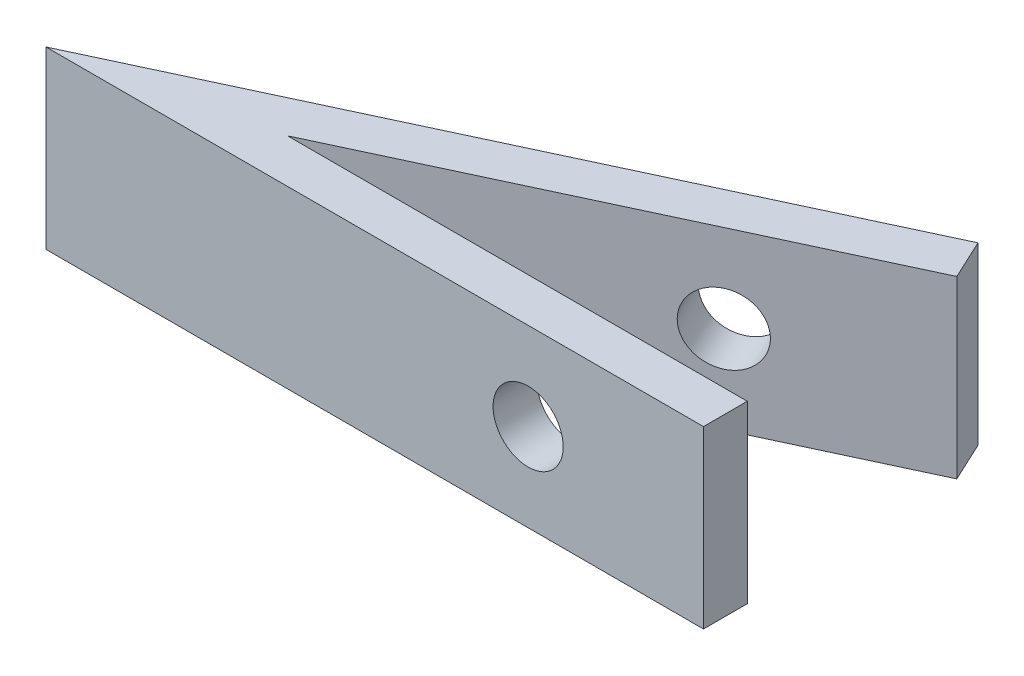
ISO-10303-21;
HEADER;
FILE_DESCRIPTION(('STEP AP214'),'2;1');
FILE_NAME('part.step','',(''),(''),'','','');
FILE_SCHEMA(('AUTOMOTIVE_DESIGN { 1 0 10303 214 1 1 1 1 }'));
ENDSEC;
DATA;
#1=APPLICATION_CONTEXT('core data for automotive mechanical design processes');
#2=APPLICATION_PROTOCOL_DEFINITION('international standard','automotive_design',2000,#1);
#3=PRODUCT_CONTEXT('',#1,'mechanical');
#4=PRODUCT('Part','Part','',(#3));
#5=PRODUCT_RELATED_PRODUCT_CATEGORY('part','',(#4));
#6=PRODUCT_DEFINITION_FORMATION('','',#4);
#7=PRODUCT_DEFINITION_CONTEXT('part definition',#1,'design');
#8=PRODUCT_DEFINITION('design','',#6,#7);
#9=PRODUCT_DEFINITION_SHAPE('','',#8);
#10=(LENGTH_UNIT() NAMED_UNIT(*) SI_UNIT(.MILLI.,.METRE.));
#11=(NAMED_UNIT(*) PLANE_ANGLE_UNIT() SI_UNIT($,.RADIAN.));
#12=(NAMED_UNIT(*) SI_UNIT($,.STERADIAN.) SOLID_ANGLE_UNIT());
#13=UNCERTAINTY_MEASURE_WITH_UNIT(LENGTH_MEASURE(1.E-05),#10,'distance_accuracy_value','');
#14=(GEOMETRIC_REPRESENTATION_CONTEXT(3) GLOBAL_UNCERTAINTY_ASSIGNED_CONTEXT((#13)) GLOBAL_UNIT_ASSIGNED_CONTEXT((#10,
#11,#12)) REPRESENTATION_CONTEXT('',''));
#15=CARTESIAN_POINT('',(0.,0.,0.));
#16=DIRECTION('',(0.,0.,1.));
#17=DIRECTION('',(1.,0.,0.));
#18=AXIS2_PLACEMENT_3D('',#15,#16,#17);
#19=CARTESIAN_POINT('',(0.,20.,0.));
#20=DIRECTION('',(0.,0.,-1.));
#21=DIRECTION('',(-1.,0.,0.));
#22=AXIS2_PLACEMENT_3D('',#19,#20,#21);
#23=PLANE('',#22);
#24=CARTESIAN_POINT('',(17.6796770048478,10.,0.));
#25=DIRECTION('',(0.,0.,1.));
#26=DIRECTION('',(1.,0.,0.));
#27=AXIS2_PLACEMENT_3D('',#24,#25,#26);
#28=CIRCLE('',#27,4.);
#29=CARTESIAN_POINT('',(21.6796770048478,10.,0.));
#30=VERTEX_POINT('',#29);
#31=EDGE_CURVE('E157',#30,#30,#28,.T.);
#32=ORIENTED_EDGE('',*,*,#31,.F.);
#33=EDGE_LOOP('',(#32));
#34=FACE_BOUND('',#33,.T.);
#35=DIRECTION('',(1.,0.,0.));
#36=VECTOR('',#35,1.);
#37=CARTESIAN_POINT('',(0.,0.,0.));
#38=LINE('',#37,#36);
#39=CARTESIAN_POINT('',(-37.3203229951522,0.,0.));
#40=VERTEX_POINT('',#39);
#41=CARTESIAN_POINT('',(37.6796770048478,0.,0.));
#42=VERTEX_POINT('',#41);
#43=EDGE_CURVE('E83',#40,#42,#38,.T.);
#44=ORIENTED_EDGE('',*,*,#43,.T.);
#45=DIRECTION('',(0.,-1.,0.));
#46=VECTOR('',#45,1.);
#47=CARTESIAN_POINT('',(37.6796770048478,20.,0.));
#48=LINE('',#47,#46);
#49=CARTESIAN_POINT('',(37.6796770048478,20.,0.));
#50=VERTEX_POINT('',#49);
#51=EDGE_CURVE('E11',#50,#42,#48,.T.);
#52=ORIENTED_EDGE('',*,*,#51,.F.);
#53=DIRECTION('',(1.,0.,0.));
#54=VECTOR('',#53,1.);
#55=CARTESIAN_POINT('',(-37.3203229951522,20.,0.));
#56=LINE('',#55,#54);
#57=CARTESIAN_POINT('',(-37.3203229951522,20.,0.));
#58=VERTEX_POINT('',#57);
#59=EDGE_CURVE('E89',#58,#50,#56,.T.);
#60=ORIENTED_EDGE('',*,*,#59,.F.);
#61=DIRECTION('',(0.,-1.,0.));
#62=VECTOR('',#61,1.);
#63=CARTESIAN_POINT('',(-37.3203229951522,20.,0.));
#64=LINE('',#63,#62);
#65=EDGE_CURVE('E117',#58,#40,#64,.T.);
#66=ORIENTED_EDGE('',*,*,#65,.T.);
#67=EDGE_LOOP('',(#44,#52,#60,#66));
#68=FACE_BOUND('',#67,.T.);
#69=ADVANCED_FACE('F37',(#34,#68),#23,.F.);
#70=CARTESIAN_POINT('',(37.6796770048478,20.,0.));
#71=DIRECTION('',(-1.,0.,0.));
#72=DIRECTION('',(0.,0.,1.));
#73=AXIS2_PLACEMENT_3D('',#70,#71,#72);
#74=PLANE('',#73);
#75=DIRECTION('',(0.,0.,-1.));
#76=VECTOR('',#75,1.);
#77=CARTESIAN_POINT('',(37.6796770048478,0.,0.));
#78=LINE('',#77,#76);
#79=CARTESIAN_POINT('',(37.6796770048478,0.,-5.));
#80=VERTEX_POINT('',#79);
#81=EDGE_CURVE('E122',#42,#80,#78,.T.);
#82=ORIENTED_EDGE('',*,*,#81,.T.);
#83=DIRECTION('',(0.,-1.,0.));
#84=VECTOR('',#83,1.);
#85=CARTESIAN_POINT('',(37.6796770048478,20.,-5.));
#86=LINE('',#85,#84);
#87=CARTESIAN_POINT('',(37.6796770048478,20.,-5.));
#88=VERTEX_POINT('',#87);
#89=EDGE_CURVE('E45',#88,#80,#86,.T.);
#90=ORIENTED_EDGE('',*,*,#89,.F.);
#91=DIRECTION('',(0.,0.,-1.));
#92=VECTOR('',#91,1.);
#93=CARTESIAN_POINT('',(37.6796770048478,20.,0.));
#94=LINE('',#93,#92);
#95=EDGE_CURVE('E145',#50,#88,#94,.T.);
#96=ORIENTED_EDGE('',*,*,#95,.F.);
#97=ORIENTED_EDGE('',*,*,#51,.T.);
#98=EDGE_LOOP('',(#82,#90,#96,#97));
#99=FACE_BOUND('',#98,.T.);
#100=ADVANCED_FACE('F164',(#99),#74,.F.);
#101=CARTESIAN_POINT('',(37.6796770048478,20.,-5.));
#102=DIRECTION('',(0.,0.,1.));
#103=DIRECTION('',(1.,0.,0.));
#104=AXIS2_PLACEMENT_3D('',#101,#102,#103);
#105=PLANE('',#104);
#106=CARTESIAN_POINT('',(17.6796770048478,10.,-5.));
#107=DIRECTION('',(0.,0.,1.));
#108=DIRECTION('',(1.,0.,0.));
#109=AXIS2_PLACEMENT_3D('',#106,#107,#108);
#110=CIRCLE('',#109,4.);
#111=CARTESIAN_POINT('',(21.6796770048478,10.,-5.));
#112=VERTEX_POINT('',#111);
#113=EDGE_CURVE('E154',#112,#112,#110,.F.);
#114=ORIENTED_EDGE('',*,*,#113,.F.);
#115=EDGE_LOOP('',(#114));
#116=FACE_BOUND('',#115,.T.);
#117=DIRECTION('',(-1.,0.,0.));
#118=VECTOR('',#117,1.);
#119=CARTESIAN_POINT('',(37.6796770048478,0.,-5.));
#120=LINE('',#119,#118);
#121=CARTESIAN_POINT('',(-14.7667804768416,0.,-4.99999999999999));
#122=VERTEX_POINT('',#121);
#123=EDGE_CURVE('E125',#80,#122,#120,.T.);
#124=ORIENTED_EDGE('',*,*,#123,.T.);
#125=DIRECTION('',(0.,-1.,0.));
#126=VECTOR('',#125,1.);
#127=CARTESIAN_POINT('',(-14.7667804768416,20.,-4.99999999999999));
#128=LINE('',#127,#126);
#129=CARTESIAN_POINT('',(-14.7667804768416,20.,-4.99999999999999));
#130=VERTEX_POINT('',#129);
#131=EDGE_CURVE('E112',#130,#122,#128,.T.);
#132=ORIENTED_EDGE('',*,*,#131,.F.);
#133=DIRECTION('',(-1.,0.,0.));
#134=VECTOR('',#133,1.);
#135=CARTESIAN_POINT('',(37.6796770048478,20.,-5.));
#136=LINE('',#135,#134);
#137=EDGE_CURVE('E103',#88,#130,#136,.T.);
#138=ORIENTED_EDGE('',*,*,#137,.F.);
#139=ORIENTED_EDGE('',*,*,#89,.T.);
#140=EDGE_LOOP('',(#124,#132,#138,#139));
#141=FACE_BOUND('',#140,.T.);
#142=ADVANCED_FACE('F138',(#116,#141),#105,.F.);
#143=CARTESIAN_POINT('',(-14.7667804768416,20.,-4.99999999999999));
#144=DIRECTION('',(-0.422618261740694,0.,-0.906307787036652));
#145=DIRECTION('',(-0.906307787036652,0.,0.422618261740694));
#146=AXIS2_PLACEMENT_3D('',#143,#144,#145);
#147=PLANE('',#146);
#148=CARTESIAN_POINT('',(19.1712355357505,10.,-20.8255567692584));
#149=DIRECTION('',(-0.422618261740694,0.,-0.906307787036652));
#150=DIRECTION('',(-0.906307787036652,0.,0.422618261740694));
#151=AXIS2_PLACEMENT_3D('',#148,#149,#150);
#152=CIRCLE('',#151,4.00000000000001);
#153=CARTESIAN_POINT('',(15.5460043876038,10.,-19.1350837222956));
#154=VERTEX_POINT('',#153);
#155=EDGE_CURVE('E123',#154,#154,#152,.F.);
#156=ORIENTED_EDGE('',*,*,#155,.F.);
#157=EDGE_LOOP('',(#156));
#158=FACE_BOUND('',#157,.T.);
#159=DIRECTION('',(0.906307787036652,0.,-0.422618261740694));
#160=VECTOR('',#159,1.);
#161=CARTESIAN_POINT('',(-14.7667804768416,0.,-4.99999999999999));
#162=LINE('',#161,#160);
#163=CARTESIAN_POINT('',(37.2973912764835,0.,-29.2779220040723));
#164=VERTEX_POINT('',#163);
#165=EDGE_CURVE('E111',#122,#164,#162,.T.);
#166=ORIENTED_EDGE('',*,*,#165,.T.);
#167=DIRECTION('',(0.,-1.,0.));
#168=VECTOR('',#167,1.);
#169=CARTESIAN_POINT('',(37.2973912764835,20.,-29.2779220040723));
#170=LINE('',#169,#168);
#171=CARTESIAN_POINT('',(37.2973912764835,20.,-29.2779220040723));
#172=VERTEX_POINT('',#171);
#173=EDGE_CURVE('E108',#172,#164,#170,.T.);
#174=ORIENTED_EDGE('',*,*,#173,.F.);
#175=DIRECTION('',(0.906307787036652,0.,-0.422618261740694));
#176=VECTOR('',#175,1.);
#177=CARTESIAN_POINT('',(-14.7667804768416,20.,-4.99999999999999));
#178=LINE('',#177,#176);
#179=EDGE_CURVE('E97',#130,#172,#178,.T.);
#180=ORIENTED_EDGE('',*,*,#179,.F.);
#181=ORIENTED_EDGE('',*,*,#131,.T.);
#182=EDGE_LOOP('',(#166,#174,#180,#181));
#183=FACE_BOUND('',#182,.T.);
#184=ADVANCED_FACE('F109',(#158,#183),#147,.F.);
#185=CARTESIAN_POINT('',(37.2973912764835,20.,-29.2779220040723));
#186=DIRECTION('',(-0.906307787036652,0.,0.422618261740695));
#187=DIRECTION('',(0.422618261740695,0.,0.906307787036652));
#188=AXIS2_PLACEMENT_3D('',#185,#186,#187);
#189=PLANE('',#188);
#190=DIRECTION('',(-0.422618261740694,0.,-0.906307787036652));
#191=VECTOR('',#190,1.);
#192=CARTESIAN_POINT('',(37.2973912764835,0.,-29.2779220040723));
#193=LINE('',#192,#191);
#194=CARTESIAN_POINT('',(35.18429996778,0.,-33.8094609392555));
#195=VERTEX_POINT('',#194);
#196=EDGE_CURVE('E76',#164,#195,#193,.T.);
#197=ORIENTED_EDGE('',*,*,#196,.T.);
#198=DIRECTION('',(0.,-1.,0.));
#199=VECTOR('',#198,1.);
#200=CARTESIAN_POINT('',(35.18429996778,20.,-33.8094609392555));
#201=LINE('',#200,#199);
#202=CARTESIAN_POINT('',(35.18429996778,20.,-33.8094609392555));
#203=VERTEX_POINT('',#202);
#204=EDGE_CURVE('E113',#203,#195,#201,.T.);
#205=ORIENTED_EDGE('',*,*,#204,.F.);
#206=DIRECTION('',(-0.422618261740694,0.,-0.906307787036652));
#207=VECTOR('',#206,1.);
#208=CARTESIAN_POINT('',(37.2973912764835,20.,-29.2779220040723));
#209=LINE('',#208,#207);
#210=EDGE_CURVE('E101',#172,#203,#209,.T.);
#211=ORIENTED_EDGE('',*,*,#210,.F.);
#212=ORIENTED_EDGE('',*,*,#173,.T.);
#213=EDGE_LOOP('',(#197,#205,#211,#212));
#214=FACE_BOUND('',#213,.T.);
#215=ADVANCED_FACE('F115',(#214),#189,.F.);
#216=CARTESIAN_POINT('',(35.18429996778,20.,-33.8094609392555));
#217=DIRECTION('',(0.422618261740694,0.,0.906307787036652));
#218=DIRECTION('',(0.906307787036652,0.,-0.422618261740694));
#219=AXIS2_PLACEMENT_3D('',#216,#217,#218);
#220=PLANE('',#219);
#221=CARTESIAN_POINT('',(17.058144227047,10.,-25.3570957044417));
#222=DIRECTION('',(-0.422618261740694,0.,-0.906307787036653));
#223=DIRECTION('',(-0.906307787036653,0.,0.422618261740694));
#224=AXIS2_PLACEMENT_3D('',#221,#222,#223);
#225=CIRCLE('',#224,4.00000000000001);
#226=CARTESIAN_POINT('',(13.4329130789004,10.,-23.6666226574789));
#227=VERTEX_POINT('',#226);
#228=EDGE_CURVE('E151',#227,#227,#225,.T.);
#229=ORIENTED_EDGE('',*,*,#228,.F.);
#230=EDGE_LOOP('',(#229));
#231=FACE_BOUND('',#230,.T.);
#232=DIRECTION('',(-0.906307787036652,0.,0.422618261740694));
#233=VECTOR('',#232,1.);
#234=CARTESIAN_POINT('',(35.18429996778,0.,-33.8094609392555));
#235=LINE('',#234,#233);
#236=EDGE_CURVE('E129',#195,#40,#235,.T.);
#237=ORIENTED_EDGE('',*,*,#236,.T.);
#238=ORIENTED_EDGE('',*,*,#65,.F.);
#239=DIRECTION('',(-0.906307787036652,0.,0.422618261740694));
#240=VECTOR('',#239,1.);
#241=CARTESIAN_POINT('',(35.18429996778,20.,-33.8094609392555));
#242=LINE('',#241,#240);
#243=EDGE_CURVE('E53',#203,#58,#242,.T.);
#244=ORIENTED_EDGE('',*,*,#243,.F.);
#245=ORIENTED_EDGE('',*,*,#204,.T.);
#246=EDGE_LOOP('',(#237,#238,#244,#245));
#247=FACE_BOUND('',#246,.T.);
#248=ADVANCED_FACE('F143',(#231,#247),#220,.F.);
#249=CARTESIAN_POINT('',(0.,20.,0.));
#250=DIRECTION('',(0.,1.,0.));
#251=DIRECTION('',(0.,0.,1.));
#252=AXIS2_PLACEMENT_3D('',#249,#250,#251);
#253=PLANE('',#252);
#254=ORIENTED_EDGE('',*,*,#59,.T.);
#255=ORIENTED_EDGE('',*,*,#95,.T.);
#256=ORIENTED_EDGE('',*,*,#137,.T.);
#257=ORIENTED_EDGE('',*,*,#179,.T.);
#258=ORIENTED_EDGE('',*,*,#210,.T.);
#259=ORIENTED_EDGE('',*,*,#243,.T.);
#260=EDGE_LOOP('',(#254,#255,#256,#257,#258,#259));
#261=FACE_BOUND('',#260,.T.);
#262=ADVANCED_FACE('F99',(#261),#253,.T.);
#263=CARTESIAN_POINT('',(0.,0.,0.));
#264=DIRECTION('',(0.,1.,0.));
#265=DIRECTION('',(0.,0.,1.));
#266=AXIS2_PLACEMENT_3D('',#263,#264,#265);
#267=PLANE('',#266);
#268=ORIENTED_EDGE('',*,*,#43,.F.);
#269=ORIENTED_EDGE('',*,*,#236,.F.);
#270=ORIENTED_EDGE('',*,*,#196,.F.);
#271=ORIENTED_EDGE('',*,*,#165,.F.);
#272=ORIENTED_EDGE('',*,*,#123,.F.);
#273=ORIENTED_EDGE('',*,*,#81,.F.);
#274=EDGE_LOOP('',(#268,#269,#270,#271,#272,#273));
#275=FACE_BOUND('',#274,.T.);
#276=ADVANCED_FACE('F141',(#275),#267,.F.);
#277=CARTESIAN_POINT('',(23.9526153554323,10.,-10.5718546563657));
#278=DIRECTION('',(-0.422618261740694,0.,-0.906307787036652));
#279=DIRECTION('',(-0.906307787036653,0.,0.422618261740694));
#280=AXIS2_PLACEMENT_3D('',#277,#278,#279);
#281=CYLINDRICAL_SURFACE('',#280,4.00000000000001);
#282=ORIENTED_EDGE('',*,*,#155,.T.);
#283=EDGE_LOOP('',(#282));
#284=FACE_BOUND('',#283,.T.);
#285=ORIENTED_EDGE('',*,*,#228,.T.);
#286=EDGE_LOOP('',(#285));
#287=FACE_BOUND('',#286,.T.);
#288=ADVANCED_FACE('F184',(#284,#287),#281,.F.);
#289=CARTESIAN_POINT('',(17.6796770048478,10.,-16.3137084989848));
#290=DIRECTION('',(0.,0.,1.));
#291=DIRECTION('',(1.,0.,0.));
#292=AXIS2_PLACEMENT_3D('',#289,#290,#291);
#293=CYLINDRICAL_SURFACE('',#292,4.);
#294=ORIENTED_EDGE('',*,*,#113,.T.);
#295=EDGE_LOOP('',(#294));
#296=FACE_BOUND('',#295,.T.);
#297=ORIENTED_EDGE('',*,*,#31,.T.);
#298=EDGE_LOOP('',(#297));
#299=FACE_BOUND('',#298,.T.);
#300=ADVANCED_FACE('F161',(#296,#299),#293,.F.);
#301=CLOSED_SHELL('',(#69,#100,#142,#184,#215,#248,#262,#276,#288,#300));
#302=MANIFOLD_SOLID_BREP('B2',#301);
#303=ADVANCED_BREP_SHAPE_REPRESENTATION('',(#18,#302),#14);
#304=SHAPE_DEFINITION_REPRESENTATION(#9,#303);
ENDSEC;
END-ISO-10303-21;
